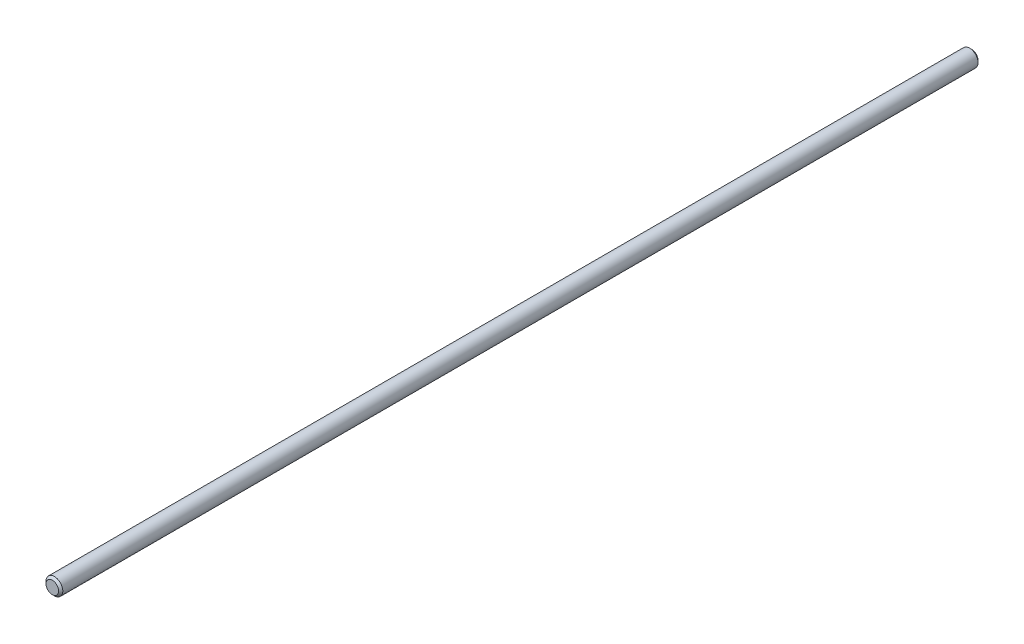
ISO-10303-21;
HEADER;
FILE_DESCRIPTION(('STEP AP214'),'2;1');
FILE_NAME('part.step','',(''),(''),'','','');
FILE_SCHEMA(('AUTOMOTIVE_DESIGN { 1 0 10303 214 1 1 1 1 }'));
ENDSEC;
DATA;
#1=APPLICATION_CONTEXT('core data for automotive mechanical design processes');
#2=APPLICATION_PROTOCOL_DEFINITION('international standard','automotive_design',2000,#1);
#3=PRODUCT_CONTEXT('',#1,'mechanical');
#4=PRODUCT('Part','Part','',(#3));
#5=PRODUCT_RELATED_PRODUCT_CATEGORY('part','',(#4));
#6=PRODUCT_DEFINITION_FORMATION('','',#4);
#7=PRODUCT_DEFINITION_CONTEXT('part definition',#1,'design');
#8=PRODUCT_DEFINITION('design','',#6,#7);
#9=PRODUCT_DEFINITION_SHAPE('','',#8);
#10=(LENGTH_UNIT() NAMED_UNIT(*) SI_UNIT(.MILLI.,.METRE.));
#11=(NAMED_UNIT(*) PLANE_ANGLE_UNIT() SI_UNIT($,.RADIAN.));
#12=(NAMED_UNIT(*) SI_UNIT($,.STERADIAN.) SOLID_ANGLE_UNIT());
#13=UNCERTAINTY_MEASURE_WITH_UNIT(LENGTH_MEASURE(1.E-05),#10,'distance_accuracy_value','');
#14=(GEOMETRIC_REPRESENTATION_CONTEXT(3) GLOBAL_UNCERTAINTY_ASSIGNED_CONTEXT((#13)) GLOBAL_UNIT_ASSIGNED_CONTEXT((#10,
#11,#12)) REPRESENTATION_CONTEXT('',''));
#15=CARTESIAN_POINT('',(0.,0.,0.));
#16=DIRECTION('',(0.,0.,1.));
#17=DIRECTION('',(1.,0.,0.));
#18=AXIS2_PLACEMENT_3D('',#15,#16,#17);
#19=CARTESIAN_POINT('',(0.,0.,438.));
#20=DIRECTION('',(0.,0.,-1.));
#21=DIRECTION('',(-1.,0.,0.));
#22=AXIS2_PLACEMENT_3D('',#19,#20,#21);
#23=CYLINDRICAL_SURFACE('',#22,4.);
#24=CARTESIAN_POINT('',(0.,0.,0.999999999999945));
#25=DIRECTION('',(0.,0.,1.));
#26=DIRECTION('',(1.,0.,0.));
#27=AXIS2_PLACEMENT_3D('',#24,#25,#26);
#28=CIRCLE('',#27,4.);
#29=CARTESIAN_POINT('',(4.,0.,0.999999999999945));
#30=VERTEX_POINT('',#29);
#31=EDGE_CURVE('E42',#30,#30,#28,.T.);
#32=ORIENTED_EDGE('',*,*,#31,.T.);
#33=EDGE_LOOP('',(#32));
#34=FACE_BOUND('',#33,.T.);
#35=CARTESIAN_POINT('',(0.,0.,437.));
#36=DIRECTION('',(0.,0.,1.));
#37=DIRECTION('',(1.,0.,0.));
#38=AXIS2_PLACEMENT_3D('',#35,#36,#37);
#39=CIRCLE('',#38,4.);
#40=CARTESIAN_POINT('',(4.,0.,437.));
#41=VERTEX_POINT('',#40);
#42=EDGE_CURVE('E46',#41,#41,#39,.F.);
#43=ORIENTED_EDGE('',*,*,#42,.T.);
#44=EDGE_LOOP('',(#43));
#45=FACE_BOUND('',#44,.T.);
#46=ADVANCED_FACE('F31',(#34,#45),#23,.T.);
#47=CARTESIAN_POINT('',(0.,0.,438.));
#48=DIRECTION('',(0.,0.,1.));
#49=DIRECTION('',(1.,0.,0.));
#50=AXIS2_PLACEMENT_3D('',#47,#48,#49);
#51=PLANE('',#50);
#52=CARTESIAN_POINT('',(0.,0.,438.));
#53=DIRECTION('',(0.,0.,1.));
#54=DIRECTION('',(1.,0.,0.));
#55=AXIS2_PLACEMENT_3D('',#52,#53,#54);
#56=CIRCLE('',#55,3.00000000000006);
#57=CARTESIAN_POINT('',(3.00000000000006,0.,438.));
#58=VERTEX_POINT('',#57);
#59=EDGE_CURVE('E10',#58,#58,#56,.T.);
#60=ORIENTED_EDGE('',*,*,#59,.T.);
#61=EDGE_LOOP('',(#60));
#62=FACE_BOUND('',#61,.T.);
#63=ADVANCED_FACE('F62',(#62),#51,.T.);
#64=CARTESIAN_POINT('',(0.,0.,0.));
#65=DIRECTION('',(0.,0.,1.));
#66=DIRECTION('',(1.,0.,0.));
#67=AXIS2_PLACEMENT_3D('',#64,#65,#66);
#68=PLANE('',#67);
#69=CARTESIAN_POINT('',(0.,0.,0.));
#70=DIRECTION('',(0.,0.,1.));
#71=DIRECTION('',(1.,0.,0.));
#72=AXIS2_PLACEMENT_3D('',#69,#70,#71);
#73=CIRCLE('',#72,3.00000000000006);
#74=CARTESIAN_POINT('',(3.00000000000006,0.,0.));
#75=VERTEX_POINT('',#74);
#76=EDGE_CURVE('E38',#75,#75,#73,.F.);
#77=ORIENTED_EDGE('',*,*,#76,.T.);
#78=EDGE_LOOP('',(#77));
#79=FACE_BOUND('',#78,.T.);
#80=ADVANCED_FACE('F59',(#79),#68,.F.);
#81=CARTESIAN_POINT('',(0.,0.,0.999999999999945));
#82=DIRECTION('',(0.,0.,1.));
#83=DIRECTION('',(1.,0.,0.));
#84=AXIS2_PLACEMENT_3D('',#81,#82,#83);
#85=CONICAL_SURFACE('',#84,4.,0.785398163397447);
#86=ORIENTED_EDGE('',*,*,#76,.F.);
#87=EDGE_LOOP('',(#86));
#88=FACE_BOUND('',#87,.T.);
#89=ORIENTED_EDGE('',*,*,#31,.F.);
#90=EDGE_LOOP('',(#89));
#91=FACE_BOUND('',#90,.T.);
#92=ADVANCED_FACE('F55',(#88,#91),#85,.T.);
#93=CARTESIAN_POINT('',(0.,0.,438.));
#94=DIRECTION('',(0.,0.,-1.));
#95=DIRECTION('',(-1.,0.,0.));
#96=AXIS2_PLACEMENT_3D('',#93,#94,#95);
#97=CONICAL_SURFACE('',#96,3.00000000000006,0.785398163397447);
#98=ORIENTED_EDGE('',*,*,#42,.F.);
#99=EDGE_LOOP('',(#98));
#100=FACE_BOUND('',#99,.T.);
#101=ORIENTED_EDGE('',*,*,#59,.F.);
#102=EDGE_LOOP('',(#101));
#103=FACE_BOUND('',#102,.T.);
#104=ADVANCED_FACE('F33',(#100,#103),#97,.T.);
#105=CLOSED_SHELL('',(#46,#63,#80,#92,#104));
#106=MANIFOLD_SOLID_BREP('B2',#105);
#107=ADVANCED_BREP_SHAPE_REPRESENTATION('',(#18,#106),#14);
#108=SHAPE_DEFINITION_REPRESENTATION(#9,#107);
ENDSEC;
END-ISO-10303-21;
